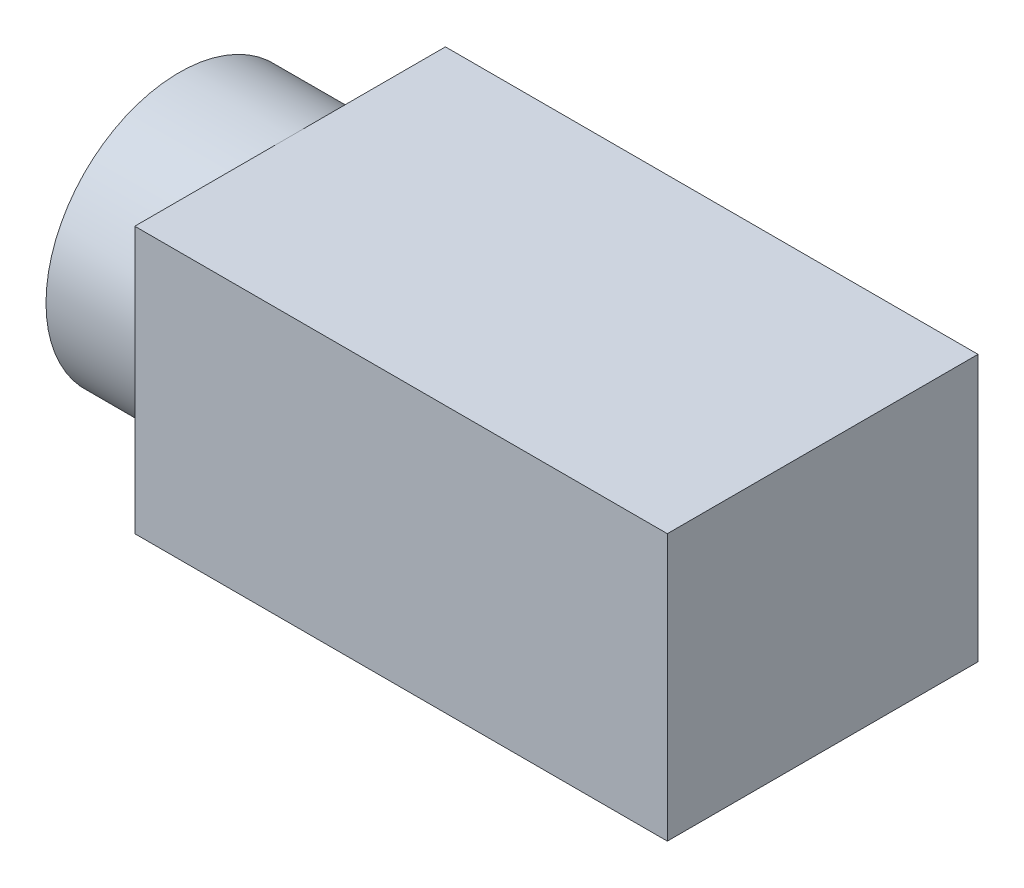
ISO-10303-21;
HEADER;
FILE_DESCRIPTION(('STEP AP214'),'2;1');
FILE_NAME('part.step','',(''),(''),'','','');
FILE_SCHEMA(('AUTOMOTIVE_DESIGN { 1 0 10303 214 1 1 1 1 }'));
ENDSEC;
DATA;
#1=APPLICATION_CONTEXT('core data for automotive mechanical design processes');
#2=APPLICATION_PROTOCOL_DEFINITION('international standard','automotive_design',2000,#1);
#3=PRODUCT_CONTEXT('',#1,'mechanical');
#4=PRODUCT('Part','Part','',(#3));
#5=PRODUCT_RELATED_PRODUCT_CATEGORY('part','',(#4));
#6=PRODUCT_DEFINITION_FORMATION('','',#4);
#7=PRODUCT_DEFINITION_CONTEXT('part definition',#1,'design');
#8=PRODUCT_DEFINITION('design','',#6,#7);
#9=PRODUCT_DEFINITION_SHAPE('','',#8);
#10=(LENGTH_UNIT() NAMED_UNIT(*) SI_UNIT(.MILLI.,.METRE.));
#11=(NAMED_UNIT(*) PLANE_ANGLE_UNIT() SI_UNIT($,.RADIAN.));
#12=(NAMED_UNIT(*) SI_UNIT($,.STERADIAN.) SOLID_ANGLE_UNIT());
#13=UNCERTAINTY_MEASURE_WITH_UNIT(LENGTH_MEASURE(1.E-05),#10,'distance_accuracy_value','');
#14=(GEOMETRIC_REPRESENTATION_CONTEXT(3) GLOBAL_UNCERTAINTY_ASSIGNED_CONTEXT((#13)) GLOBAL_UNIT_ASSIGNED_CONTEXT((#10,
#11,#12)) REPRESENTATION_CONTEXT('',''));
#15=CARTESIAN_POINT('',(0.,0.,0.));
#16=DIRECTION('',(0.,0.,1.));
#17=DIRECTION('',(1.,0.,0.));
#18=AXIS2_PLACEMENT_3D('',#15,#16,#17);
#19=CARTESIAN_POINT('',(0.,0.,7.));
#20=DIRECTION('',(0.,1.,0.));
#21=DIRECTION('',(0.,0.,1.));
#22=AXIS2_PLACEMENT_3D('',#19,#20,#21);
#23=PLANE('',#22);
#24=CARTESIAN_POINT('',(2.,0.,3.5));
#25=DIRECTION('',(0.,1.,0.));
#26=DIRECTION('',(0.,0.,1.));
#27=AXIS2_PLACEMENT_3D('',#24,#25,#26);
#28=CIRCLE('',#27,0.5);
#29=CARTESIAN_POINT('',(2.,0.,4.));
#30=VERTEX_POINT('',#29);
#31=EDGE_CURVE('E109',#30,#30,#28,.F.);
#32=ORIENTED_EDGE('',*,*,#31,.F.);
#33=EDGE_LOOP('',(#32));
#34=FACE_BOUND('',#33,.T.);
#35=DIRECTION('',(1.,0.,0.));
#36=VECTOR('',#35,1.);
#37=CARTESIAN_POINT('',(0.,0.,0.));
#38=LINE('',#37,#36);
#39=CARTESIAN_POINT('',(0.,0.,0.));
#40=VERTEX_POINT('',#39);
#41=CARTESIAN_POINT('',(12.,0.,0.));
#42=VERTEX_POINT('',#41);
#43=EDGE_CURVE('E124',#40,#42,#38,.T.);
#44=ORIENTED_EDGE('',*,*,#43,.T.);
#45=DIRECTION('',(0.,0.,-1.));
#46=VECTOR('',#45,1.);
#47=CARTESIAN_POINT('',(12.,0.,7.));
#48=LINE('',#47,#46);
#49=CARTESIAN_POINT('',(12.,0.,7.));
#50=VERTEX_POINT('',#49);
#51=EDGE_CURVE('E130',#50,#42,#48,.T.);
#52=ORIENTED_EDGE('',*,*,#51,.F.);
#53=DIRECTION('',(1.,0.,0.));
#54=VECTOR('',#53,1.);
#55=CARTESIAN_POINT('',(0.,0.,7.));
#56=LINE('',#55,#54);
#57=CARTESIAN_POINT('',(0.,0.,7.));
#58=VERTEX_POINT('',#57);
#59=EDGE_CURVE('E87',#58,#50,#56,.T.);
#60=ORIENTED_EDGE('',*,*,#59,.F.);
#61=DIRECTION('',(0.,0.,-1.));
#62=VECTOR('',#61,1.);
#63=CARTESIAN_POINT('',(0.,0.,7.));
#64=LINE('',#63,#62);
#65=CARTESIAN_POINT('',(0.,0.,3.5));
#66=VERTEX_POINT('',#65);
#67=EDGE_CURVE('E110',#58,#66,#64,.T.);
#68=ORIENTED_EDGE('',*,*,#67,.T.);
#69=EDGE_CURVE('E104',#66,#40,#64,.T.);
#70=ORIENTED_EDGE('',*,*,#69,.T.);
#71=EDGE_LOOP('',(#44,#52,#60,#68,#70));
#72=FACE_BOUND('',#71,.T.);
#73=CARTESIAN_POINT('',(9.,0.,3.5));
#74=DIRECTION('',(0.,1.,0.));
#75=DIRECTION('',(0.,0.,1.));
#76=AXIS2_PLACEMENT_3D('',#73,#74,#75);
#77=CIRCLE('',#76,0.500000000000001);
#78=CARTESIAN_POINT('',(9.,0.,4.));
#79=VERTEX_POINT('',#78);
#80=EDGE_CURVE('E112',#79,#79,#77,.F.);
#81=ORIENTED_EDGE('',*,*,#80,.F.);
#82=EDGE_LOOP('',(#81));
#83=FACE_BOUND('',#82,.T.);
#84=ADVANCED_FACE('F33',(#34,#72,#83),#23,.F.);
#85=CARTESIAN_POINT('',(0.,0.,7.));
#86=DIRECTION('',(1.,0.,0.));
#87=DIRECTION('',(0.,0.,-1.));
#88=AXIS2_PLACEMENT_3D('',#85,#86,#87);
#89=PLANE('',#88);
#90=CARTESIAN_POINT('',(0.,3.,3.5));
#91=DIRECTION('',(-1.,0.,0.));
#92=DIRECTION('',(0.,0.,1.));
#93=AXIS2_PLACEMENT_3D('',#90,#91,#92);
#94=CIRCLE('',#93,3.);
#95=CARTESIAN_POINT('',(0.,6.,3.5));
#96=VERTEX_POINT('',#95);
#97=EDGE_CURVE('E102',#96,#66,#94,.T.);
#98=ORIENTED_EDGE('',*,*,#97,.F.);
#99=DIRECTION('',(0.,0.,-1.));
#100=VECTOR('',#99,1.);
#101=CARTESIAN_POINT('',(0.,6.,7.));
#102=LINE('',#101,#100);
#103=CARTESIAN_POINT('',(0.,6.,0.));
#104=VERTEX_POINT('',#103);
#105=EDGE_CURVE('E79',#96,#104,#102,.T.);
#106=ORIENTED_EDGE('',*,*,#105,.T.);
#107=DIRECTION('',(0.,-1.,0.));
#108=VECTOR('',#107,1.);
#109=CARTESIAN_POINT('',(0.,0.,0.));
#110=LINE('',#109,#108);
#111=EDGE_CURVE('E122',#104,#40,#110,.T.);
#112=ORIENTED_EDGE('',*,*,#111,.T.);
#113=ORIENTED_EDGE('',*,*,#69,.F.);
#114=EDGE_LOOP('',(#98,#106,#112,#113));
#115=FACE_BOUND('',#114,.T.);
#116=ADVANCED_FACE('F103',(#115),#89,.F.);
#117=EDGE_CURVE('E48',#66,#96,#94,.T.);
#118=ORIENTED_EDGE('',*,*,#117,.F.);
#119=ORIENTED_EDGE('',*,*,#67,.F.);
#120=DIRECTION('',(0.,-1.,0.));
#121=VECTOR('',#120,1.);
#122=CARTESIAN_POINT('',(0.,0.,7.));
#123=LINE('',#122,#121);
#124=CARTESIAN_POINT('',(0.,6.,7.));
#125=VERTEX_POINT('',#124);
#126=EDGE_CURVE('E92',#125,#58,#123,.T.);
#127=ORIENTED_EDGE('',*,*,#126,.F.);
#128=EDGE_CURVE('E90',#125,#96,#102,.T.);
#129=ORIENTED_EDGE('',*,*,#128,.T.);
#130=EDGE_LOOP('',(#118,#119,#127,#129));
#131=FACE_BOUND('',#130,.T.);
#132=ADVANCED_FACE('F91',(#131),#89,.F.);
#133=CARTESIAN_POINT('',(12.,0.,7.));
#134=DIRECTION('',(-1.,0.,0.));
#135=DIRECTION('',(0.,0.,1.));
#136=AXIS2_PLACEMENT_3D('',#133,#134,#135);
#137=PLANE('',#136);
#138=DIRECTION('',(0.,1.,0.));
#139=VECTOR('',#138,1.);
#140=CARTESIAN_POINT('',(12.,0.,0.));
#141=LINE('',#140,#139);
#142=CARTESIAN_POINT('',(12.,6.,0.));
#143=VERTEX_POINT('',#142);
#144=EDGE_CURVE('E126',#42,#143,#141,.T.);
#145=ORIENTED_EDGE('',*,*,#144,.T.);
#146=DIRECTION('',(0.,0.,-1.));
#147=VECTOR('',#146,1.);
#148=CARTESIAN_POINT('',(12.,6.,7.));
#149=LINE('',#148,#147);
#150=CARTESIAN_POINT('',(12.,6.,7.));
#151=VERTEX_POINT('',#150);
#152=EDGE_CURVE('E94',#151,#143,#149,.T.);
#153=ORIENTED_EDGE('',*,*,#152,.F.);
#154=DIRECTION('',(0.,1.,0.));
#155=VECTOR('',#154,1.);
#156=CARTESIAN_POINT('',(12.,0.,7.));
#157=LINE('',#156,#155);
#158=EDGE_CURVE('E119',#50,#151,#157,.T.);
#159=ORIENTED_EDGE('',*,*,#158,.F.);
#160=ORIENTED_EDGE('',*,*,#51,.T.);
#161=EDGE_LOOP('',(#145,#153,#159,#160));
#162=FACE_BOUND('',#161,.T.);
#163=ADVANCED_FACE('F158',(#162),#137,.F.);
#164=CARTESIAN_POINT('',(0.,6.,7.));
#165=DIRECTION('',(0.,-1.,0.));
#166=DIRECTION('',(0.,0.,-1.));
#167=AXIS2_PLACEMENT_3D('',#164,#165,#166);
#168=PLANE('',#167);
#169=DIRECTION('',(-1.,0.,0.));
#170=VECTOR('',#169,1.);
#171=CARTESIAN_POINT('',(0.,6.,0.));
#172=LINE('',#171,#170);
#173=EDGE_CURVE('E99',#143,#104,#172,.T.);
#174=ORIENTED_EDGE('',*,*,#173,.T.);
#175=ORIENTED_EDGE('',*,*,#105,.F.);
#176=ORIENTED_EDGE('',*,*,#128,.F.);
#177=DIRECTION('',(-1.,0.,0.));
#178=VECTOR('',#177,1.);
#179=CARTESIAN_POINT('',(0.,6.,7.));
#180=LINE('',#179,#178);
#181=EDGE_CURVE('E57',#151,#125,#180,.T.);
#182=ORIENTED_EDGE('',*,*,#181,.F.);
#183=ORIENTED_EDGE('',*,*,#152,.T.);
#184=EDGE_LOOP('',(#174,#175,#176,#182,#183));
#185=FACE_BOUND('',#184,.T.);
#186=ADVANCED_FACE('F96',(#185),#168,.F.);
#187=CARTESIAN_POINT('',(0.,0.,7.));
#188=DIRECTION('',(0.,0.,-1.));
#189=DIRECTION('',(-1.,0.,0.));
#190=AXIS2_PLACEMENT_3D('',#187,#188,#189);
#191=PLANE('',#190);
#192=ORIENTED_EDGE('',*,*,#126,.T.);
#193=ORIENTED_EDGE('',*,*,#59,.T.);
#194=ORIENTED_EDGE('',*,*,#158,.T.);
#195=ORIENTED_EDGE('',*,*,#181,.T.);
#196=EDGE_LOOP('',(#192,#193,#194,#195));
#197=FACE_BOUND('',#196,.T.);
#198=ADVANCED_FACE('F164',(#197),#191,.F.);
#199=CARTESIAN_POINT('',(0.,0.,0.));
#200=DIRECTION('',(0.,0.,-1.));
#201=DIRECTION('',(-1.,0.,0.));
#202=AXIS2_PLACEMENT_3D('',#199,#200,#201);
#203=PLANE('',#202);
#204=ORIENTED_EDGE('',*,*,#111,.F.);
#205=ORIENTED_EDGE('',*,*,#173,.F.);
#206=ORIENTED_EDGE('',*,*,#144,.F.);
#207=ORIENTED_EDGE('',*,*,#43,.F.);
#208=EDGE_LOOP('',(#204,#205,#206,#207));
#209=FACE_BOUND('',#208,.T.);
#210=ADVANCED_FACE('F165',(#209),#203,.T.);
#211=CARTESIAN_POINT('',(-2.5,3.,3.5));
#212=DIRECTION('',(1.,0.,0.));
#213=DIRECTION('',(0.,0.,-1.));
#214=AXIS2_PLACEMENT_3D('',#211,#212,#213);
#215=CYLINDRICAL_SURFACE('',#214,3.);
#216=CARTESIAN_POINT('',(-2.5,3.,3.5));
#217=DIRECTION('',(-1.,0.,0.));
#218=DIRECTION('',(0.,0.,1.));
#219=AXIS2_PLACEMENT_3D('',#216,#217,#218);
#220=CIRCLE('',#219,3.);
#221=CARTESIAN_POINT('',(-2.5,3.,6.5));
#222=VERTEX_POINT('',#221);
#223=EDGE_CURVE('E106',#222,#222,#220,.T.);
#224=ORIENTED_EDGE('',*,*,#223,.F.);
#225=EDGE_LOOP('',(#224));
#226=FACE_BOUND('',#225,.T.);
#227=ORIENTED_EDGE('',*,*,#97,.T.);
#228=ORIENTED_EDGE('',*,*,#117,.T.);
#229=EDGE_LOOP('',(#227,#228));
#230=FACE_BOUND('',#229,.T.);
#231=ADVANCED_FACE('F108',(#226,#230),#215,.T.);
#232=CARTESIAN_POINT('',(-2.5,3.,3.5));
#233=DIRECTION('',(-1.,0.,0.));
#234=DIRECTION('',(0.,0.,1.));
#235=AXIS2_PLACEMENT_3D('',#232,#233,#234);
#236=PLANE('',#235);
#237=ORIENTED_EDGE('',*,*,#223,.T.);
#238=EDGE_LOOP('',(#237));
#239=FACE_BOUND('',#238,.T.);
#240=ADVANCED_FACE('F173',(#239),#236,.T.);
#241=CARTESIAN_POINT('',(2.,-2.1,3.5));
#242=DIRECTION('',(0.,1.,0.));
#243=DIRECTION('',(0.,0.,1.));
#244=AXIS2_PLACEMENT_3D('',#241,#242,#243);
#245=CYLINDRICAL_SURFACE('',#244,0.5);
#246=CARTESIAN_POINT('',(2.,-1.6,3.5));
#247=DIRECTION('',(0.,1.,0.));
#248=DIRECTION('',(0.,0.,1.));
#249=AXIS2_PLACEMENT_3D('',#246,#247,#248);
#250=CIRCLE('',#249,0.5);
#251=CARTESIAN_POINT('',(2.,-1.6,4.));
#252=VERTEX_POINT('',#251);
#253=EDGE_CURVE('E11',#252,#252,#250,.T.);
#254=ORIENTED_EDGE('',*,*,#253,.T.);
#255=EDGE_LOOP('',(#254));
#256=FACE_BOUND('',#255,.T.);
#257=ORIENTED_EDGE('',*,*,#31,.T.);
#258=EDGE_LOOP('',(#257));
#259=FACE_BOUND('',#258,.T.);
#260=ADVANCED_FACE('F147',(#256,#259),#245,.T.);
#261=CARTESIAN_POINT('',(9.,-2.1,3.5));
#262=DIRECTION('',(0.,1.,0.));
#263=DIRECTION('',(0.,0.,1.));
#264=AXIS2_PLACEMENT_3D('',#261,#262,#263);
#265=CYLINDRICAL_SURFACE('',#264,0.500000000000001);
#266=CARTESIAN_POINT('',(9.,-1.6,3.5));
#267=DIRECTION('',(0.,1.,0.));
#268=DIRECTION('',(0.,0.,1.));
#269=AXIS2_PLACEMENT_3D('',#266,#267,#268);
#270=CIRCLE('',#269,0.500000000000001);
#271=CARTESIAN_POINT('',(9.,-1.6,4.));
#272=VERTEX_POINT('',#271);
#273=EDGE_CURVE('E41',#272,#272,#270,.T.);
#274=ORIENTED_EDGE('',*,*,#273,.T.);
#275=EDGE_LOOP('',(#274));
#276=FACE_BOUND('',#275,.T.);
#277=ORIENTED_EDGE('',*,*,#80,.T.);
#278=EDGE_LOOP('',(#277));
#279=FACE_BOUND('',#278,.T.);
#280=ADVANCED_FACE('F137',(#276,#279),#265,.T.);
#281=CARTESIAN_POINT('',(9.,-1.6,3.5));
#282=DIRECTION('',(0.,0.,1.));
#283=DIRECTION('',(1.,0.,0.));
#284=AXIS2_PLACEMENT_3D('',#281,#282,#283);
#285=SPHERICAL_SURFACE('',#284,0.5);
#286=CARTESIAN_POINT('',(9.,-1.6,3.5));
#287=DIRECTION('',(0.,1.,0.));
#288=DIRECTION('',(0.,0.,1.));
#289=AXIS2_PLACEMENT_3D('',#286,#287,#288);
#290=SPHERICAL_SURFACE('',#289,0.5);
#291=ORIENTED_EDGE('',*,*,#273,.F.);
#292=EDGE_LOOP('',(#291));
#293=FACE_BOUND('',#292,.T.);
#294=ADVANCED_FACE('F140',(#293),#290,.T.);
#295=CARTESIAN_POINT('',(2.,-1.6,3.5));
#296=DIRECTION('',(0.,0.,1.));
#297=DIRECTION('',(1.,0.,0.));
#298=AXIS2_PLACEMENT_3D('',#295,#296,#297);
#299=SPHERICAL_SURFACE('',#298,0.5);
#300=CARTESIAN_POINT('',(2.,-1.6,3.5));
#301=DIRECTION('',(0.,1.,0.));
#302=DIRECTION('',(0.,0.,1.));
#303=AXIS2_PLACEMENT_3D('',#300,#301,#302);
#304=SPHERICAL_SURFACE('',#303,0.5);
#305=ORIENTED_EDGE('',*,*,#253,.F.);
#306=EDGE_LOOP('',(#305));
#307=FACE_BOUND('',#306,.T.);
#308=ADVANCED_FACE('F35',(#307),#304,.T.);
#309=CLOSED_SHELL('',(#84,#116,#132,#163,#186,#198,#210,#231,#240,#260,#280,#294,#308));
#310=MANIFOLD_SOLID_BREP('B2',#309);
#311=ADVANCED_BREP_SHAPE_REPRESENTATION('',(#18,#310),#14);
#312=SHAPE_DEFINITION_REPRESENTATION(#9,#311);
ENDSEC;
END-ISO-10303-21;
